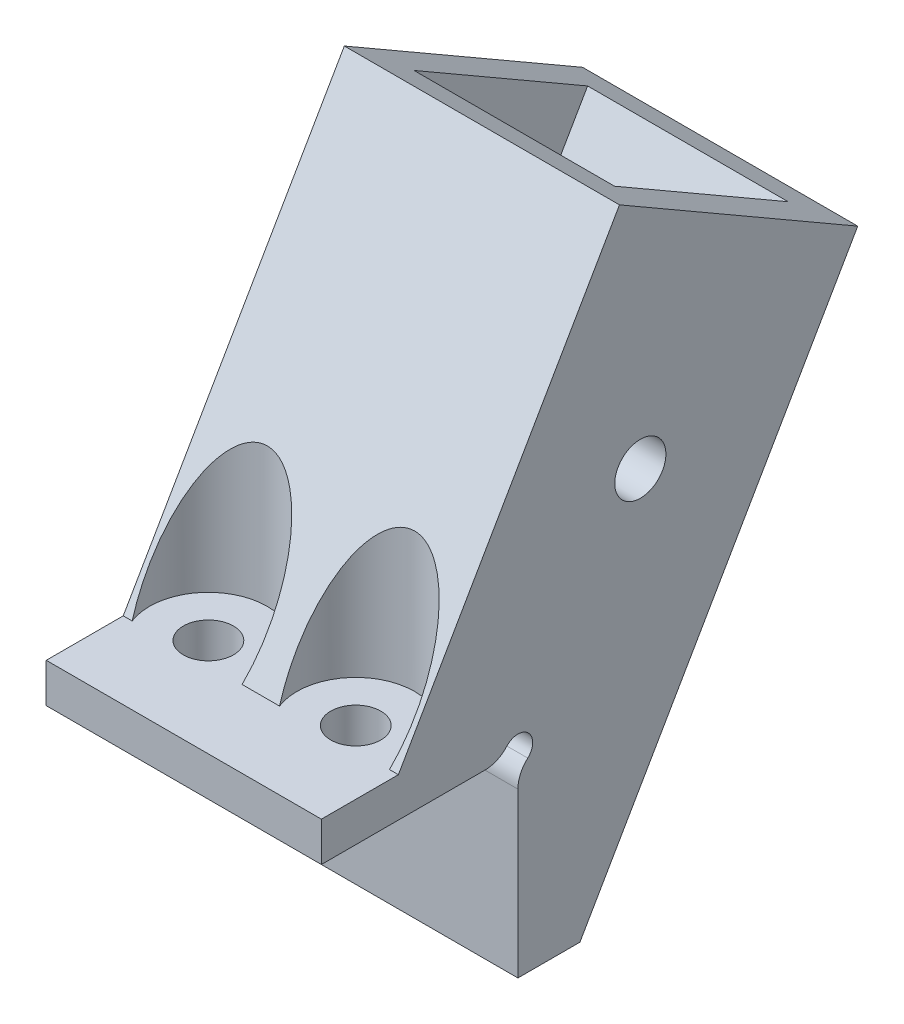
ISO-10303-21;
HEADER;
FILE_DESCRIPTION(('STEP AP214'),'2;1');
FILE_NAME('part.step','',(''),(''),'','','');
FILE_SCHEMA(('AUTOMOTIVE_DESIGN { 1 0 10303 214 1 1 1 1 }'));
ENDSEC;
DATA;
#1=APPLICATION_CONTEXT('core data for automotive mechanical design processes');
#2=APPLICATION_PROTOCOL_DEFINITION('international standard','automotive_design',2000,#1);
#3=PRODUCT_CONTEXT('',#1,'mechanical');
#4=PRODUCT('Part','Part','',(#3));
#5=PRODUCT_RELATED_PRODUCT_CATEGORY('part','',(#4));
#6=PRODUCT_DEFINITION_FORMATION('','',#4);
#7=PRODUCT_DEFINITION_CONTEXT('part definition',#1,'design');
#8=PRODUCT_DEFINITION('design','',#6,#7);
#9=PRODUCT_DEFINITION_SHAPE('','',#8);
#10=(LENGTH_UNIT() NAMED_UNIT(*) SI_UNIT(.MILLI.,.METRE.));
#11=(NAMED_UNIT(*) PLANE_ANGLE_UNIT() SI_UNIT($,.RADIAN.));
#12=(NAMED_UNIT(*) SI_UNIT($,.STERADIAN.) SOLID_ANGLE_UNIT());
#13=UNCERTAINTY_MEASURE_WITH_UNIT(LENGTH_MEASURE(1.E-05),#10,'distance_accuracy_value','');
#14=(GEOMETRIC_REPRESENTATION_CONTEXT(3) GLOBAL_UNCERTAINTY_ASSIGNED_CONTEXT((#13)) GLOBAL_UNIT_ASSIGNED_CONTEXT((#10,
#11,#12)) REPRESENTATION_CONTEXT('',''));
#15=CARTESIAN_POINT('',(0.,0.,0.));
#16=DIRECTION('',(0.,0.,1.));
#17=DIRECTION('',(1.,0.,0.));
#18=AXIS2_PLACEMENT_3D('',#15,#16,#17);
#19=CARTESIAN_POINT('',(0.,0.,16.1658075373095));
#20=DIRECTION('',(0.,0.499999999999998,0.86602540378444));
#21=DIRECTION('',(0.,-0.86602540378444,0.499999999999998));
#22=AXIS2_PLACEMENT_3D('',#19,#20,#21);
#23=PLANE('',#22);
#24=DIRECTION('',(1.,0.,0.));
#25=VECTOR('',#24,1.);
#26=CARTESIAN_POINT('',(0.,0.,16.1658075373095));
#27=LINE('',#26,#25);
#28=CARTESIAN_POINT('',(0.,0.,16.1658075373095));
#29=VERTEX_POINT('',#28);
#30=CARTESIAN_POINT('',(0.904530608489277,0.,16.1658075373095));
#31=VERTEX_POINT('',#30);
#32=EDGE_CURVE('E246',#29,#31,#27,.T.);
#33=ORIENTED_EDGE('',*,*,#32,.T.);
#34=CARTESIAN_POINT('',(6.5,3.7512886940357,14.));
#35=DIRECTION('',(0.,0.499999999999998,0.86602540378444));
#36=DIRECTION('',(0.,-0.86602540378444,0.499999999999998));
#37=AXIS2_PLACEMENT_3D('',#34,#35,#36);
#38=ELLIPSE('',#37,12.0000000000001,6.);
#39=CARTESIAN_POINT('',(12.0954693915107,0.,16.1658075373095));
#40=VERTEX_POINT('',#39);
#41=EDGE_CURVE('E290',#31,#40,#38,.F.);
#42=ORIENTED_EDGE('',*,*,#41,.T.);
#43=CARTESIAN_POINT('',(15.9045306084893,0.,16.1658075373095));
#44=VERTEX_POINT('',#43);
#45=EDGE_CURVE('E250',#40,#44,#27,.T.);
#46=ORIENTED_EDGE('',*,*,#45,.T.);
#47=CARTESIAN_POINT('',(21.5,3.7512886940357,14.));
#48=DIRECTION('',(0.,0.499999999999998,0.86602540378444));
#49=DIRECTION('',(0.,-0.86602540378444,0.499999999999998));
#50=AXIS2_PLACEMENT_3D('',#47,#48,#49);
#51=ELLIPSE('',#50,12.,6.);
#52=CARTESIAN_POINT('',(27.0954693915107,0.,16.1658075373095));
#53=VERTEX_POINT('',#52);
#54=EDGE_CURVE('E287',#44,#53,#51,.F.);
#55=ORIENTED_EDGE('',*,*,#54,.T.);
#56=CARTESIAN_POINT('',(28.,0.,16.1658075373095));
#57=VERTEX_POINT('',#56);
#58=EDGE_CURVE('E251',#53,#57,#27,.T.);
#59=ORIENTED_EDGE('',*,*,#58,.T.);
#60=DIRECTION('',(0.,-0.86602540378444,0.499999999999998));
#61=VECTOR('',#60,1.);
#62=CARTESIAN_POINT('',(28.,0.,16.1658075373095));
#63=LINE('',#62,#61);
#64=CARTESIAN_POINT('',(28.,38.9711431702998,-6.3341924626904));
#65=VERTEX_POINT('',#64);
#66=EDGE_CURVE('E232',#65,#57,#63,.T.);
#67=ORIENTED_EDGE('',*,*,#66,.F.);
#68=DIRECTION('',(1.,0.,0.));
#69=VECTOR('',#68,1.);
#70=CARTESIAN_POINT('',(0.,38.9711431702998,-6.3341924626904));
#71=LINE('',#70,#69);
#72=CARTESIAN_POINT('',(0.,38.9711431702998,-6.3341924626904));
#73=VERTEX_POINT('',#72);
#74=EDGE_CURVE('E252',#73,#65,#71,.T.);
#75=ORIENTED_EDGE('',*,*,#74,.F.);
#76=DIRECTION('',(0.,-0.86602540378444,0.499999999999998));
#77=VECTOR('',#76,1.);
#78=CARTESIAN_POINT('',(0.,0.,16.1658075373095));
#79=LINE('',#78,#77);
#80=EDGE_CURVE('E235',#73,#29,#79,.T.);
#81=ORIENTED_EDGE('',*,*,#80,.T.);
#82=EDGE_LOOP('',(#33,#42,#46,#55,#59,#67,#75,#81));
#83=FACE_BOUND('',#82,.T.);
#84=ADVANCED_FACE('F37',(#83),#23,.T.);
#85=CARTESIAN_POINT('',(21.5,38.9711431702998,14.));
#86=DIRECTION('',(0.,-1.,0.));
#87=DIRECTION('',(0.,0.,-1.));
#88=AXIS2_PLACEMENT_3D('',#85,#86,#87);
#89=CYLINDRICAL_SURFACE('',#88,2.55);
#90=CARTESIAN_POINT('',(21.5,-4.,14.));
#91=DIRECTION('',(0.,-1.,0.));
#92=DIRECTION('',(0.,0.,1.));
#93=AXIS2_PLACEMENT_3D('',#90,#91,#92);
#94=CIRCLE('',#93,2.55);
#95=CARTESIAN_POINT('',(21.5,-4.,16.55));
#96=VERTEX_POINT('',#95);
#97=EDGE_CURVE('E213',#96,#96,#94,.T.);
#98=ORIENTED_EDGE('',*,*,#97,.T.);
#99=EDGE_LOOP('',(#98));
#100=FACE_BOUND('',#99,.T.);
#101=CARTESIAN_POINT('',(21.5,0.,14.));
#102=DIRECTION('',(0.,-1.,0.));
#103=DIRECTION('',(0.,0.,-1.));
#104=AXIS2_PLACEMENT_3D('',#101,#102,#103);
#105=CIRCLE('',#104,2.55);
#106=CARTESIAN_POINT('',(21.5,0.,11.45));
#107=VERTEX_POINT('',#106);
#108=EDGE_CURVE('E219',#107,#107,#105,.T.);
#109=ORIENTED_EDGE('',*,*,#108,.F.);
#110=EDGE_LOOP('',(#109));
#111=FACE_BOUND('',#110,.T.);
#112=ADVANCED_FACE('F380',(#100,#111),#89,.F.);
#113=CARTESIAN_POINT('',(6.5,38.9711431702998,14.));
#114=DIRECTION('',(0.,-1.,0.));
#115=DIRECTION('',(0.,0.,-1.));
#116=AXIS2_PLACEMENT_3D('',#113,#114,#115);
#117=CYLINDRICAL_SURFACE('',#116,2.55);
#118=CARTESIAN_POINT('',(6.5,-4.,14.));
#119=DIRECTION('',(0.,-1.,0.));
#120=DIRECTION('',(0.,0.,-1.));
#121=AXIS2_PLACEMENT_3D('',#118,#119,#120);
#122=CIRCLE('',#121,2.55);
#123=CARTESIAN_POINT('',(6.5,-4.,11.45));
#124=VERTEX_POINT('',#123);
#125=EDGE_CURVE('E216',#124,#124,#122,.T.);
#126=ORIENTED_EDGE('',*,*,#125,.T.);
#127=EDGE_LOOP('',(#126));
#128=FACE_BOUND('',#127,.T.);
#129=CARTESIAN_POINT('',(6.5,0.,14.));
#130=DIRECTION('',(0.,-1.,0.));
#131=DIRECTION('',(0.,0.,-1.));
#132=AXIS2_PLACEMENT_3D('',#129,#130,#131);
#133=CIRCLE('',#132,2.55);
#134=CARTESIAN_POINT('',(6.5,0.,11.45));
#135=VERTEX_POINT('',#134);
#136=EDGE_CURVE('E224',#135,#135,#133,.T.);
#137=ORIENTED_EDGE('',*,*,#136,.F.);
#138=EDGE_LOOP('',(#137));
#139=FACE_BOUND('',#138,.T.);
#140=ADVANCED_FACE('F385',(#128,#139),#117,.F.);
#141=CARTESIAN_POINT('',(28.,0.,0.));
#142=DIRECTION('',(0.,-1.,0.));
#143=DIRECTION('',(0.,0.,-1.));
#144=AXIS2_PLACEMENT_3D('',#141,#142,#143);
#145=PLANE('',#144);
#146=ORIENTED_EDGE('',*,*,#45,.F.);
#147=CARTESIAN_POINT('',(6.5,0.,14.));
#148=DIRECTION('',(0.,1.,0.));
#149=DIRECTION('',(0.,0.,1.));
#150=AXIS2_PLACEMENT_3D('',#147,#148,#149);
#151=CIRCLE('',#150,6.);
#152=EDGE_CURVE('E210',#40,#31,#151,.T.);
#153=ORIENTED_EDGE('',*,*,#152,.T.);
#154=ORIENTED_EDGE('',*,*,#32,.F.);
#155=DIRECTION('',(0.,0.,1.));
#156=VECTOR('',#155,1.);
#157=CARTESIAN_POINT('',(0.,0.,0.));
#158=LINE('',#157,#156);
#159=CARTESIAN_POINT('',(0.,0.,24.));
#160=VERTEX_POINT('',#159);
#161=EDGE_CURVE('E249',#29,#160,#158,.T.);
#162=ORIENTED_EDGE('',*,*,#161,.T.);
#163=DIRECTION('',(-1.,0.,0.));
#164=VECTOR('',#163,1.);
#165=CARTESIAN_POINT('',(28.,0.,24.));
#166=LINE('',#165,#164);
#167=CARTESIAN_POINT('',(28.,0.,24.));
#168=VERTEX_POINT('',#167);
#169=EDGE_CURVE('E284',#168,#160,#166,.T.);
#170=ORIENTED_EDGE('',*,*,#169,.F.);
#171=DIRECTION('',(0.,0.,1.));
#172=VECTOR('',#171,1.);
#173=CARTESIAN_POINT('',(28.,0.,0.));
#174=LINE('',#173,#172);
#175=EDGE_CURVE('E258',#57,#168,#174,.T.);
#176=ORIENTED_EDGE('',*,*,#175,.F.);
#177=ORIENTED_EDGE('',*,*,#58,.F.);
#178=CARTESIAN_POINT('',(21.5,0.,14.));
#179=DIRECTION('',(0.,1.,0.));
#180=DIRECTION('',(0.,0.,1.));
#181=AXIS2_PLACEMENT_3D('',#178,#179,#180);
#182=CIRCLE('',#181,6.);
#183=EDGE_CURVE('E207',#53,#44,#182,.T.);
#184=ORIENTED_EDGE('',*,*,#183,.T.);
#185=EDGE_LOOP('',(#146,#153,#154,#162,#170,#176,#177,#184));
#186=FACE_BOUND('',#185,.T.);
#187=ORIENTED_EDGE('',*,*,#108,.T.);
#188=EDGE_LOOP('',(#187));
#189=FACE_BOUND('',#188,.T.);
#190=ORIENTED_EDGE('',*,*,#136,.T.);
#191=EDGE_LOOP('',(#190));
#192=FACE_BOUND('',#191,.T.);
#193=ADVANCED_FACE('F348',(#186,#189,#192),#145,.F.);
#194=CARTESIAN_POINT('',(28.,0.,24.));
#195=DIRECTION('',(0.,0.,-1.));
#196=DIRECTION('',(-1.,0.,0.));
#197=AXIS2_PLACEMENT_3D('',#194,#195,#196);
#198=PLANE('',#197);
#199=DIRECTION('',(0.,-1.,0.));
#200=VECTOR('',#199,1.);
#201=CARTESIAN_POINT('',(0.,0.,24.));
#202=LINE('',#201,#200);
#203=CARTESIAN_POINT('',(0.,-4.,24.));
#204=VERTEX_POINT('',#203);
#205=EDGE_CURVE('E271',#160,#204,#202,.T.);
#206=ORIENTED_EDGE('',*,*,#205,.T.);
#207=DIRECTION('',(-1.,0.,0.));
#208=VECTOR('',#207,1.);
#209=CARTESIAN_POINT('',(28.,-4.,24.));
#210=LINE('',#209,#208);
#211=CARTESIAN_POINT('',(28.,-4.,24.));
#212=VERTEX_POINT('',#211);
#213=EDGE_CURVE('E281',#212,#204,#210,.T.);
#214=ORIENTED_EDGE('',*,*,#213,.F.);
#215=DIRECTION('',(0.,-1.,0.));
#216=VECTOR('',#215,1.);
#217=CARTESIAN_POINT('',(28.,0.,24.));
#218=LINE('',#217,#216);
#219=EDGE_CURVE('E260',#168,#212,#218,.T.);
#220=ORIENTED_EDGE('',*,*,#219,.F.);
#221=ORIENTED_EDGE('',*,*,#169,.T.);
#222=EDGE_LOOP('',(#206,#214,#220,#221));
#223=FACE_BOUND('',#222,.T.);
#224=ADVANCED_FACE('F341',(#223),#198,.F.);
#225=CARTESIAN_POINT('',(28.,-4.,24.));
#226=DIRECTION('',(0.,1.,0.));
#227=DIRECTION('',(0.,0.,1.));
#228=AXIS2_PLACEMENT_3D('',#225,#226,#227);
#229=PLANE('',#228);
#230=ORIENTED_EDGE('',*,*,#125,.F.);
#231=EDGE_LOOP('',(#230));
#232=FACE_BOUND('',#231,.T.);
#233=ORIENTED_EDGE('',*,*,#97,.F.);
#234=EDGE_LOOP('',(#233));
#235=FACE_BOUND('',#234,.T.);
#236=DIRECTION('',(0.,0.,-1.));
#237=VECTOR('',#236,1.);
#238=CARTESIAN_POINT('',(0.,-4.,24.));
#239=LINE('',#238,#237);
#240=CARTESIAN_POINT('',(0.,-4.,7.35410196624969));
#241=VERTEX_POINT('',#240);
#242=EDGE_CURVE('E273',#204,#241,#239,.T.);
#243=ORIENTED_EDGE('',*,*,#242,.T.);
#244=DIRECTION('',(1.,0.,0.));
#245=VECTOR('',#244,1.);
#246=CARTESIAN_POINT('',(28.,-4.,7.35410196624969));
#247=LINE('',#246,#245);
#248=CARTESIAN_POINT('',(28.,-4.,7.35410196624969));
#249=VERTEX_POINT('',#248);
#250=EDGE_CURVE('E11',#241,#249,#247,.T.);
#251=ORIENTED_EDGE('',*,*,#250,.T.);
#252=DIRECTION('',(0.,0.,-1.));
#253=VECTOR('',#252,1.);
#254=CARTESIAN_POINT('',(28.,-4.,24.));
#255=LINE('',#254,#253);
#256=EDGE_CURVE('E263',#212,#249,#255,.T.);
#257=ORIENTED_EDGE('',*,*,#256,.F.);
#258=ORIENTED_EDGE('',*,*,#213,.T.);
#259=EDGE_LOOP('',(#243,#251,#257,#258));
#260=FACE_BOUND('',#259,.T.);
#261=ADVANCED_FACE('F336',(#232,#235,#260),#229,.F.);
#262=CARTESIAN_POINT('',(28.,-4.,4.));
#263=DIRECTION('',(0.,0.,-1.));
#264=DIRECTION('',(0.,1.,0.));
#265=AXIS2_PLACEMENT_3D('',#262,#263,#264);
#266=PLANE('',#265);
#267=DIRECTION('',(0.,-1.,0.));
#268=VECTOR('',#267,1.);
#269=CARTESIAN_POINT('',(28.,-4.,4.));
#270=LINE('',#269,#268);
#271=CARTESIAN_POINT('',(28.,-7.35410196624969,4.));
#272=VERTEX_POINT('',#271);
#273=CARTESIAN_POINT('',(28.,-24.,4.));
#274=VERTEX_POINT('',#273);
#275=EDGE_CURVE('E265',#272,#274,#270,.T.);
#276=ORIENTED_EDGE('',*,*,#275,.F.);
#277=DIRECTION('',(1.,0.,0.));
#278=VECTOR('',#277,1.);
#279=CARTESIAN_POINT('',(28.,-7.35410196624969,4.));
#280=LINE('',#279,#278);
#281=CARTESIAN_POINT('',(0.,-7.35410196624969,4.));
#282=VERTEX_POINT('',#281);
#283=EDGE_CURVE('E301',#272,#282,#280,.F.);
#284=ORIENTED_EDGE('',*,*,#283,.T.);
#285=DIRECTION('',(0.,-1.,0.));
#286=VECTOR('',#285,1.);
#287=CARTESIAN_POINT('',(0.,-4.,4.));
#288=LINE('',#287,#286);
#289=CARTESIAN_POINT('',(0.,-24.,4.));
#290=VERTEX_POINT('',#289);
#291=EDGE_CURVE('E276',#282,#290,#288,.T.);
#292=ORIENTED_EDGE('',*,*,#291,.T.);
#293=DIRECTION('',(-1.,0.,0.));
#294=VECTOR('',#293,1.);
#295=CARTESIAN_POINT('',(28.,-24.,4.));
#296=LINE('',#295,#294);
#297=EDGE_CURVE('E269',#274,#290,#296,.T.);
#298=ORIENTED_EDGE('',*,*,#297,.F.);
#299=EDGE_LOOP('',(#276,#284,#292,#298));
#300=FACE_BOUND('',#299,.T.);
#301=ADVANCED_FACE('F322',(#300),#266,.F.);
#302=CARTESIAN_POINT('',(28.,-24.,4.));
#303=DIRECTION('',(0.,1.,0.));
#304=DIRECTION('',(0.,0.,1.));
#305=AXIS2_PLACEMENT_3D('',#302,#303,#304);
#306=PLANE('',#305);
#307=DIRECTION('',(0.,0.,-1.));
#308=VECTOR('',#307,1.);
#309=CARTESIAN_POINT('',(0.,-24.,4.));
#310=LINE('',#309,#308);
#311=CARTESIAN_POINT('',(0.,-24.,-2.30940107675857));
#312=VERTEX_POINT('',#311);
#313=EDGE_CURVE('E261',#290,#312,#310,.T.);
#314=ORIENTED_EDGE('',*,*,#313,.T.);
#315=DIRECTION('',(1.,0.,0.));
#316=VECTOR('',#315,1.);
#317=CARTESIAN_POINT('',(0.,-24.,-2.30940107675857));
#318=LINE('',#317,#316);
#319=CARTESIAN_POINT('',(28.,-24.,-2.30940107675857));
#320=VERTEX_POINT('',#319);
#321=EDGE_CURVE('E238',#312,#320,#318,.T.);
#322=ORIENTED_EDGE('',*,*,#321,.T.);
#323=DIRECTION('',(0.,0.,-1.));
#324=VECTOR('',#323,1.);
#325=CARTESIAN_POINT('',(28.,-24.,4.));
#326=LINE('',#325,#324);
#327=EDGE_CURVE('E267',#274,#320,#326,.T.);
#328=ORIENTED_EDGE('',*,*,#327,.F.);
#329=ORIENTED_EDGE('',*,*,#297,.T.);
#330=EDGE_LOOP('',(#314,#322,#328,#329));
#331=FACE_BOUND('',#330,.T.);
#332=ADVANCED_FACE('F361',(#331),#306,.F.);
#333=CARTESIAN_POINT('',(28.,0.,0.));
#334=DIRECTION('',(1.,0.,0.));
#335=DIRECTION('',(0.,0.,-1.));
#336=AXIS2_PLACEMENT_3D('',#333,#334,#335);
#337=PLANE('',#336);
#338=CARTESIAN_POINT('',(28.,-4.,4.));
#339=DIRECTION('',(1.,0.,0.));
#340=DIRECTION('',(0.,0.,-1.));
#341=AXIS2_PLACEMENT_3D('',#338,#339,#340);
#342=CIRCLE('',#341,1.5);
#343=CARTESIAN_POINT('',(28.,-5.1180339887499,3.));
#344=VERTEX_POINT('',#343);
#345=CARTESIAN_POINT('',(28.,-3.,5.1180339887499));
#346=VERTEX_POINT('',#345);
#347=EDGE_CURVE('E317',#344,#346,#342,.T.);
#348=ORIENTED_EDGE('',*,*,#347,.F.);
#349=CARTESIAN_POINT('',(28.,-7.35410196624969,1.));
#350=DIRECTION('',(1.,0.,0.));
#351=DIRECTION('',(0.,0.,-1.));
#352=AXIS2_PLACEMENT_3D('',#349,#350,#351);
#353=CIRCLE('',#352,3.);
#354=EDGE_CURVE('E45',#344,#272,#353,.T.);
#355=ORIENTED_EDGE('',*,*,#354,.T.);
#356=ORIENTED_EDGE('',*,*,#275,.T.);
#357=ORIENTED_EDGE('',*,*,#327,.T.);
#358=DIRECTION('',(0.,0.86602540378444,-0.499999999999998));
#359=VECTOR('',#358,1.);
#360=CARTESIAN_POINT('',(28.,-24.,-2.30940107675857));
#361=LINE('',#360,#359);
#362=CARTESIAN_POINT('',(28.,24.9711431702999,-30.5829037686547));
#363=VERTEX_POINT('',#362);
#364=EDGE_CURVE('E227',#320,#363,#361,.T.);
#365=ORIENTED_EDGE('',*,*,#364,.T.);
#366=DIRECTION('',(0.,0.499999999999998,0.86602540378444));
#367=VECTOR('',#366,1.);
#368=CARTESIAN_POINT('',(28.,38.9711431702998,-6.3341924626904));
#369=LINE('',#368,#367);
#370=EDGE_CURVE('E241',#363,#65,#369,.T.);
#371=ORIENTED_EDGE('',*,*,#370,.T.);
#372=ORIENTED_EDGE('',*,*,#66,.T.);
#373=ORIENTED_EDGE('',*,*,#175,.T.);
#374=ORIENTED_EDGE('',*,*,#219,.T.);
#375=ORIENTED_EDGE('',*,*,#256,.T.);
#376=CARTESIAN_POINT('',(28.,-1.,7.35410196624969));
#377=DIRECTION('',(1.,0.,0.));
#378=DIRECTION('',(0.,0.,-1.));
#379=AXIS2_PLACEMENT_3D('',#376,#377,#378);
#380=CIRCLE('',#379,3.);
#381=EDGE_CURVE('E52',#249,#346,#380,.T.);
#382=ORIENTED_EDGE('',*,*,#381,.T.);
#383=EDGE_LOOP('',(#348,#355,#356,#357,#365,#371,#372,#373,#374,#375,#382));
#384=FACE_BOUND('',#383,.T.);
#385=CARTESIAN_POINT('',(28.,14.6506350946111,-8.45854811567263));
#386=DIRECTION('',(1.,0.,0.));
#387=DIRECTION('',(0.,0.,-1.));
#388=AXIS2_PLACEMENT_3D('',#385,#386,#387);
#389=CIRCLE('',#388,2.6);
#390=CARTESIAN_POINT('',(28.,14.6506350946111,-11.0585481156726));
#391=VERTEX_POINT('',#390);
#392=EDGE_CURVE('E452',#391,#391,#389,.T.);
#393=ORIENTED_EDGE('',*,*,#392,.F.);
#394=EDGE_LOOP('',(#393));
#395=FACE_BOUND('',#394,.T.);
#396=ADVANCED_FACE('F314',(#384,#395),#337,.T.);
#397=CARTESIAN_POINT('',(0.,0.,0.));
#398=DIRECTION('',(1.,0.,0.));
#399=DIRECTION('',(0.,0.,-1.));
#400=AXIS2_PLACEMENT_3D('',#397,#398,#399);
#401=PLANE('',#400);
#402=CARTESIAN_POINT('',(0.,14.6506350946111,-8.45854811567263));
#403=DIRECTION('',(1.,0.,0.));
#404=DIRECTION('',(0.,0.,-1.));
#405=AXIS2_PLACEMENT_3D('',#402,#403,#404);
#406=CIRCLE('',#405,2.6);
#407=CARTESIAN_POINT('',(0.,14.6506350946111,-11.0585481156726));
#408=VERTEX_POINT('',#407);
#409=EDGE_CURVE('E298',#408,#408,#406,.T.);
#410=ORIENTED_EDGE('',*,*,#409,.T.);
#411=EDGE_LOOP('',(#410));
#412=FACE_BOUND('',#411,.T.);
#413=ORIENTED_EDGE('',*,*,#291,.F.);
#414=CARTESIAN_POINT('',(0.,-7.35410196624969,1.));
#415=DIRECTION('',(1.,0.,0.));
#416=DIRECTION('',(0.,0.,-1.));
#417=AXIS2_PLACEMENT_3D('',#414,#415,#416);
#418=CIRCLE('',#417,3.);
#419=CARTESIAN_POINT('',(0.,-5.1180339887499,3.));
#420=VERTEX_POINT('',#419);
#421=EDGE_CURVE('E306',#282,#420,#418,.F.);
#422=ORIENTED_EDGE('',*,*,#421,.T.);
#423=CARTESIAN_POINT('',(0.,-4.,4.));
#424=DIRECTION('',(1.,0.,0.));
#425=DIRECTION('',(0.,0.,-1.));
#426=AXIS2_PLACEMENT_3D('',#423,#424,#425);
#427=CIRCLE('',#426,1.5);
#428=CARTESIAN_POINT('',(0.,-3.,5.1180339887499));
#429=VERTEX_POINT('',#428);
#430=EDGE_CURVE('E293',#420,#429,#427,.T.);
#431=ORIENTED_EDGE('',*,*,#430,.T.);
#432=CARTESIAN_POINT('',(0.,-1.,7.35410196624969));
#433=DIRECTION('',(1.,0.,0.));
#434=DIRECTION('',(0.,0.,-1.));
#435=AXIS2_PLACEMENT_3D('',#432,#433,#434);
#436=CIRCLE('',#435,3.);
#437=EDGE_CURVE('E304',#429,#241,#436,.F.);
#438=ORIENTED_EDGE('',*,*,#437,.T.);
#439=ORIENTED_EDGE('',*,*,#242,.F.);
#440=ORIENTED_EDGE('',*,*,#205,.F.);
#441=ORIENTED_EDGE('',*,*,#161,.F.);
#442=ORIENTED_EDGE('',*,*,#80,.F.);
#443=DIRECTION('',(0.,0.499999999999998,0.86602540378444));
#444=VECTOR('',#443,1.);
#445=CARTESIAN_POINT('',(0.,38.9711431702998,-6.3341924626904));
#446=LINE('',#445,#444);
#447=CARTESIAN_POINT('',(0.,24.9711431702999,-30.5829037686547));
#448=VERTEX_POINT('',#447);
#449=EDGE_CURVE('E231',#448,#73,#446,.T.);
#450=ORIENTED_EDGE('',*,*,#449,.F.);
#451=DIRECTION('',(0.,0.86602540378444,-0.499999999999998));
#452=VECTOR('',#451,1.);
#453=CARTESIAN_POINT('',(0.,-24.,-2.30940107675857));
#454=LINE('',#453,#452);
#455=EDGE_CURVE('E228',#312,#448,#454,.T.);
#456=ORIENTED_EDGE('',*,*,#455,.F.);
#457=ORIENTED_EDGE('',*,*,#313,.F.);
#458=EDGE_LOOP('',(#413,#422,#431,#438,#439,#440,#441,#442,#450,#456,#457));
#459=FACE_BOUND('',#458,.T.);
#460=ADVANCED_FACE('F328',(#412,#459),#401,.F.);
#461=CARTESIAN_POINT('',(0.,38.9711431702998,-6.3341924626904));
#462=DIRECTION('',(0.,0.86602540378444,-0.499999999999998));
#463=DIRECTION('',(0.,0.499999999999998,0.86602540378444));
#464=AXIS2_PLACEMENT_3D('',#461,#462,#463);
#465=PLANE('',#464);
#466=DIRECTION('',(0.,0.499999999999997,0.86602540378444));
#467=VECTOR('',#466,1.);
#468=CARTESIAN_POINT('',(3.8,26.8711431702999,-27.2920072342739));
#469=LINE('',#468,#467);
#470=CARTESIAN_POINT('',(3.8,26.8711431702999,-27.2920072342739));
#471=VERTEX_POINT('',#470);
#472=CARTESIAN_POINT('',(3.8,37.0711431702998,-9.62508899707126));
#473=VERTEX_POINT('',#472);
#474=EDGE_CURVE('E173',#471,#473,#469,.T.);
#475=ORIENTED_EDGE('',*,*,#474,.F.);
#476=DIRECTION('',(-1.,0.,0.));
#477=VECTOR('',#476,1.);
#478=CARTESIAN_POINT('',(3.8,26.8711431702999,-27.2920072342739));
#479=LINE('',#478,#477);
#480=CARTESIAN_POINT('',(24.2,26.8711431702999,-27.2920072342739));
#481=VERTEX_POINT('',#480);
#482=EDGE_CURVE('E202',#481,#471,#479,.T.);
#483=ORIENTED_EDGE('',*,*,#482,.F.);
#484=DIRECTION('',(0.,-0.499999999999997,-0.86602540378444));
#485=VECTOR('',#484,1.);
#486=CARTESIAN_POINT('',(24.2,26.8711431702999,-27.2920072342739));
#487=LINE('',#486,#485);
#488=CARTESIAN_POINT('',(24.2,37.0711431702998,-9.62508899707127));
#489=VERTEX_POINT('',#488);
#490=EDGE_CURVE('E200',#489,#481,#487,.T.);
#491=ORIENTED_EDGE('',*,*,#490,.F.);
#492=DIRECTION('',(1.,0.,0.));
#493=VECTOR('',#492,1.);
#494=CARTESIAN_POINT('',(24.2,37.0711431702998,-9.62508899707127));
#495=LINE('',#494,#493);
#496=EDGE_CURVE('E197',#473,#489,#495,.T.);
#497=ORIENTED_EDGE('',*,*,#496,.F.);
#498=EDGE_LOOP('',(#475,#483,#491,#497));
#499=FACE_BOUND('',#498,.T.);
#500=ORIENTED_EDGE('',*,*,#370,.F.);
#501=DIRECTION('',(1.,0.,0.));
#502=VECTOR('',#501,1.);
#503=CARTESIAN_POINT('',(0.,24.9711431702999,-30.5829037686547));
#504=LINE('',#503,#502);
#505=EDGE_CURVE('E254',#448,#363,#504,.T.);
#506=ORIENTED_EDGE('',*,*,#505,.F.);
#507=ORIENTED_EDGE('',*,*,#449,.T.);
#508=ORIENTED_EDGE('',*,*,#74,.T.);
#509=EDGE_LOOP('',(#500,#506,#507,#508));
#510=FACE_BOUND('',#509,.T.);
#511=ADVANCED_FACE('F354',(#499,#510),#465,.T.);
#512=CARTESIAN_POINT('',(0.,-24.,-2.30940107675857));
#513=DIRECTION('',(0.,-0.499999999999998,-0.86602540378444));
#514=DIRECTION('',(0.,0.86602540378444,-0.499999999999998));
#515=AXIS2_PLACEMENT_3D('',#512,#513,#514);
#516=PLANE('',#515);
#517=ORIENTED_EDGE('',*,*,#364,.F.);
#518=ORIENTED_EDGE('',*,*,#321,.F.);
#519=ORIENTED_EDGE('',*,*,#455,.T.);
#520=ORIENTED_EDGE('',*,*,#505,.T.);
#521=EDGE_LOOP('',(#517,#518,#519,#520));
#522=FACE_BOUND('',#521,.T.);
#523=ADVANCED_FACE('F359',(#522),#516,.T.);
#524=CARTESIAN_POINT('',(6.5,28.,14.));
#525=DIRECTION('',(0.,-1.,0.));
#526=DIRECTION('',(0.,0.,-1.));
#527=AXIS2_PLACEMENT_3D('',#524,#525,#526);
#528=CYLINDRICAL_SURFACE('',#527,6.);
#529=ORIENTED_EDGE('',*,*,#152,.F.);
#530=ORIENTED_EDGE('',*,*,#41,.F.);
#531=EDGE_LOOP('',(#529,#530));
#532=FACE_BOUND('',#531,.T.);
#533=ADVANCED_FACE('F366',(#532),#528,.F.);
#534=CARTESIAN_POINT('',(21.5,28.,14.));
#535=DIRECTION('',(0.,-1.,0.));
#536=DIRECTION('',(0.,0.,-1.));
#537=AXIS2_PLACEMENT_3D('',#534,#535,#536);
#538=CYLINDRICAL_SURFACE('',#537,6.);
#539=ORIENTED_EDGE('',*,*,#183,.F.);
#540=ORIENTED_EDGE('',*,*,#54,.F.);
#541=EDGE_LOOP('',(#539,#540));
#542=FACE_BOUND('',#541,.T.);
#543=ADVANCED_FACE('F368',(#542),#538,.F.);
#544=CARTESIAN_POINT('',(3.8,0.890381056766674,-12.2920072342739));
#545=DIRECTION('',(-1.,0.,0.));
#546=DIRECTION('',(0.,0.,1.));
#547=AXIS2_PLACEMENT_3D('',#544,#545,#546);
#548=PLANE('',#547);
#549=CARTESIAN_POINT('',(3.8,14.6506350946111,-8.45854811567263));
#550=DIRECTION('',(-1.,0.,0.));
#551=DIRECTION('',(0.,0.,1.));
#552=AXIS2_PLACEMENT_3D('',#549,#550,#551);
#553=CIRCLE('',#552,2.6);
#554=CARTESIAN_POINT('',(3.8,14.6506350946111,-5.85854811567262));
#555=VERTEX_POINT('',#554);
#556=EDGE_CURVE('E297',#555,#555,#553,.T.);
#557=ORIENTED_EDGE('',*,*,#556,.T.);
#558=EDGE_LOOP('',(#557));
#559=FACE_BOUND('',#558,.T.);
#560=ORIENTED_EDGE('',*,*,#474,.T.);
#561=DIRECTION('',(0.,0.86602540378444,-0.499999999999998));
#562=VECTOR('',#561,1.);
#563=CARTESIAN_POINT('',(3.8,11.0903810567666,5.37491100292867));
#564=LINE('',#563,#562);
#565=CARTESIAN_POINT('',(3.8,11.0903810567666,5.37491100292867));
#566=VERTEX_POINT('',#565);
#567=EDGE_CURVE('E187',#566,#473,#564,.T.);
#568=ORIENTED_EDGE('',*,*,#567,.F.);
#569=DIRECTION('',(0.,0.499999999999997,0.86602540378444));
#570=VECTOR('',#569,1.);
#571=CARTESIAN_POINT('',(3.8,0.890381056766674,-12.2920072342739));
#572=LINE('',#571,#570);
#573=CARTESIAN_POINT('',(3.8,5.99038105676665,-3.45854811567263));
#574=VERTEX_POINT('',#573);
#575=EDGE_CURVE('E192',#574,#566,#572,.T.);
#576=ORIENTED_EDGE('',*,*,#575,.F.);
#577=DIRECTION('',(0.,-1.,0.));
#578=VECTOR('',#577,1.);
#579=CARTESIAN_POINT('',(3.8,5.99038105676665,-3.45854811567263));
#580=LINE('',#579,#578);
#581=CARTESIAN_POINT('',(3.8,-14.4096189432335,-3.45854811567263));
#582=VERTEX_POINT('',#581);
#583=EDGE_CURVE('E169',#574,#582,#580,.T.);
#584=ORIENTED_EDGE('',*,*,#583,.T.);
#585=DIRECTION('',(0.,0.86602540378444,-0.499999999999998));
#586=VECTOR('',#585,1.);
#587=CARTESIAN_POINT('',(3.8,0.890381056766674,-12.2920072342739));
#588=LINE('',#587,#586);
#589=EDGE_CURVE('E205',#582,#471,#588,.T.);
#590=ORIENTED_EDGE('',*,*,#589,.T.);
#591=EDGE_LOOP('',(#560,#568,#576,#584,#590));
#592=FACE_BOUND('',#591,.T.);
#593=ADVANCED_FACE('F374',(#559,#592),#548,.F.);
#594=CARTESIAN_POINT('',(3.8,0.890381056766674,-12.2920072342739));
#595=DIRECTION('',(0.,-0.499999999999998,-0.86602540378444));
#596=DIRECTION('',(0.,0.86602540378444,-0.499999999999998));
#597=AXIS2_PLACEMENT_3D('',#594,#595,#596);
#598=PLANE('',#597);
#599=ORIENTED_EDGE('',*,*,#482,.T.);
#600=ORIENTED_EDGE('',*,*,#589,.F.);
#601=DIRECTION('',(-1.,0.,0.));
#602=VECTOR('',#601,1.);
#603=CARTESIAN_POINT('',(24.2,-14.4096189432335,-3.45854811567263));
#604=LINE('',#603,#602);
#605=CARTESIAN_POINT('',(24.2,-14.4096189432335,-3.45854811567263));
#606=VERTEX_POINT('',#605);
#607=EDGE_CURVE('E174',#606,#582,#604,.T.);
#608=ORIENTED_EDGE('',*,*,#607,.F.);
#609=DIRECTION('',(0.,0.86602540378444,-0.499999999999998));
#610=VECTOR('',#609,1.);
#611=CARTESIAN_POINT('',(24.2,0.890381056766674,-12.2920072342739));
#612=LINE('',#611,#610);
#613=EDGE_CURVE('E182',#606,#481,#612,.T.);
#614=ORIENTED_EDGE('',*,*,#613,.T.);
#615=EDGE_LOOP('',(#599,#600,#608,#614));
#616=FACE_BOUND('',#615,.T.);
#617=ADVANCED_FACE('F427',(#616),#598,.F.);
#618=CARTESIAN_POINT('',(24.2,0.890381056766674,-12.2920072342739));
#619=DIRECTION('',(1.,0.,0.));
#620=DIRECTION('',(0.,0.,-1.));
#621=AXIS2_PLACEMENT_3D('',#618,#619,#620);
#622=PLANE('',#621);
#623=CARTESIAN_POINT('',(24.2,14.6506350946111,-8.45854811567263));
#624=DIRECTION('',(1.,0.,0.));
#625=DIRECTION('',(0.,0.,-1.));
#626=AXIS2_PLACEMENT_3D('',#623,#624,#625);
#627=CIRCLE('',#626,2.6);
#628=CARTESIAN_POINT('',(24.2,14.6506350946111,-11.0585481156726));
#629=VERTEX_POINT('',#628);
#630=EDGE_CURVE('E294',#629,#629,#627,.T.);
#631=ORIENTED_EDGE('',*,*,#630,.T.);
#632=EDGE_LOOP('',(#631));
#633=FACE_BOUND('',#632,.T.);
#634=ORIENTED_EDGE('',*,*,#490,.T.);
#635=ORIENTED_EDGE('',*,*,#613,.F.);
#636=DIRECTION('',(0.,-1.,0.));
#637=VECTOR('',#636,1.);
#638=CARTESIAN_POINT('',(24.2,5.99038105676664,-3.45854811567263));
#639=LINE('',#638,#637);
#640=CARTESIAN_POINT('',(24.2,5.99038105676664,-3.45854811567263));
#641=VERTEX_POINT('',#640);
#642=EDGE_CURVE('E166',#641,#606,#639,.T.);
#643=ORIENTED_EDGE('',*,*,#642,.F.);
#644=DIRECTION('',(0.,-0.499999999999997,-0.86602540378444));
#645=VECTOR('',#644,1.);
#646=CARTESIAN_POINT('',(24.2,0.890381056766674,-12.2920072342739));
#647=LINE('',#646,#645);
#648=CARTESIAN_POINT('',(24.2,11.0903810567666,5.37491100292866));
#649=VERTEX_POINT('',#648);
#650=EDGE_CURVE('E180',#649,#641,#647,.T.);
#651=ORIENTED_EDGE('',*,*,#650,.F.);
#652=DIRECTION('',(0.,0.86602540378444,-0.499999999999998));
#653=VECTOR('',#652,1.);
#654=CARTESIAN_POINT('',(24.2,11.0903810567666,5.37491100292866));
#655=LINE('',#654,#653);
#656=EDGE_CURVE('E190',#649,#489,#655,.T.);
#657=ORIENTED_EDGE('',*,*,#656,.T.);
#658=EDGE_LOOP('',(#634,#635,#643,#651,#657));
#659=FACE_BOUND('',#658,.T.);
#660=ADVANCED_FACE('F179',(#633,#659),#622,.F.);
#661=CARTESIAN_POINT('',(24.2,11.0903810567666,5.37491100292866));
#662=DIRECTION('',(0.,0.499999999999998,0.86602540378444));
#663=DIRECTION('',(0.,-0.86602540378444,0.499999999999998));
#664=AXIS2_PLACEMENT_3D('',#661,#662,#663);
#665=PLANE('',#664);
#666=ORIENTED_EDGE('',*,*,#496,.T.);
#667=ORIENTED_EDGE('',*,*,#656,.F.);
#668=DIRECTION('',(1.,0.,0.));
#669=VECTOR('',#668,1.);
#670=CARTESIAN_POINT('',(24.2,11.0903810567666,5.37491100292866));
#671=LINE('',#670,#669);
#672=EDGE_CURVE('E186',#566,#649,#671,.T.);
#673=ORIENTED_EDGE('',*,*,#672,.F.);
#674=ORIENTED_EDGE('',*,*,#567,.T.);
#675=EDGE_LOOP('',(#666,#667,#673,#674));
#676=FACE_BOUND('',#675,.T.);
#677=ADVANCED_FACE('F426',(#676),#665,.F.);
#678=CARTESIAN_POINT('',(0.,5.99038105676666,-3.45854811567263));
#679=DIRECTION('',(0.,-0.86602540378444,0.499999999999997));
#680=DIRECTION('',(0.,-0.499999999999997,-0.86602540378444));
#681=AXIS2_PLACEMENT_3D('',#678,#679,#680);
#682=PLANE('',#681);
#683=ORIENTED_EDGE('',*,*,#650,.T.);
#684=DIRECTION('',(-1.,0.,0.));
#685=VECTOR('',#684,1.);
#686=CARTESIAN_POINT('',(24.2,5.99038105676664,-3.45854811567263));
#687=LINE('',#686,#685);
#688=EDGE_CURVE('E162',#641,#574,#687,.T.);
#689=ORIENTED_EDGE('',*,*,#688,.T.);
#690=ORIENTED_EDGE('',*,*,#575,.T.);
#691=ORIENTED_EDGE('',*,*,#672,.T.);
#692=EDGE_LOOP('',(#683,#689,#690,#691));
#693=FACE_BOUND('',#692,.T.);
#694=ADVANCED_FACE('F184',(#693),#682,.F.);
#695=CARTESIAN_POINT('',(24.2,5.99038105676664,-3.45854811567263));
#696=DIRECTION('',(0.,0.,-1.));
#697=DIRECTION('',(-1.,0.,0.));
#698=AXIS2_PLACEMENT_3D('',#695,#696,#697);
#699=PLANE('',#698);
#700=ORIENTED_EDGE('',*,*,#583,.F.);
#701=ORIENTED_EDGE('',*,*,#688,.F.);
#702=ORIENTED_EDGE('',*,*,#642,.T.);
#703=ORIENTED_EDGE('',*,*,#607,.T.);
#704=EDGE_LOOP('',(#700,#701,#702,#703));
#705=FACE_BOUND('',#704,.T.);
#706=ADVANCED_FACE('F164',(#705),#699,.T.);
#707=CARTESIAN_POINT('',(0.,14.6506350946111,-8.45854811567263));
#708=DIRECTION('',(1.,0.,0.));
#709=DIRECTION('',(0.,0.,-1.));
#710=AXIS2_PLACEMENT_3D('',#707,#708,#709);
#711=CYLINDRICAL_SURFACE('',#710,2.6);
#712=ORIENTED_EDGE('',*,*,#392,.T.);
#713=EDGE_LOOP('',(#712));
#714=FACE_BOUND('',#713,.T.);
#715=ORIENTED_EDGE('',*,*,#630,.F.);
#716=EDGE_LOOP('',(#715));
#717=FACE_BOUND('',#716,.T.);
#718=ADVANCED_FACE('F418',(#714,#717),#711,.F.);
#719=ORIENTED_EDGE('',*,*,#409,.F.);
#720=EDGE_LOOP('',(#719));
#721=FACE_BOUND('',#720,.T.);
#722=ORIENTED_EDGE('',*,*,#556,.F.);
#723=EDGE_LOOP('',(#722));
#724=FACE_BOUND('',#723,.T.);
#725=ADVANCED_FACE('F413',(#721,#724),#711,.F.);
#726=CARTESIAN_POINT('',(0.,-4.,4.));
#727=DIRECTION('',(1.,0.,0.));
#728=DIRECTION('',(0.,0.,-1.));
#729=AXIS2_PLACEMENT_3D('',#726,#727,#728);
#730=CYLINDRICAL_SURFACE('',#729,1.5);
#731=ORIENTED_EDGE('',*,*,#430,.F.);
#732=DIRECTION('',(1.,0.,0.));
#733=VECTOR('',#732,1.);
#734=CARTESIAN_POINT('',(0.,-5.1180339887499,3.));
#735=LINE('',#734,#733);
#736=EDGE_CURVE('E310',#420,#344,#735,.T.);
#737=ORIENTED_EDGE('',*,*,#736,.T.);
#738=ORIENTED_EDGE('',*,*,#347,.T.);
#739=DIRECTION('',(1.,0.,0.));
#740=VECTOR('',#739,1.);
#741=CARTESIAN_POINT('',(0.,-3.,5.1180339887499));
#742=LINE('',#741,#740);
#743=EDGE_CURVE('E308',#346,#429,#742,.F.);
#744=ORIENTED_EDGE('',*,*,#743,.T.);
#745=EDGE_LOOP('',(#731,#737,#738,#744));
#746=FACE_BOUND('',#745,.T.);
#747=ADVANCED_FACE('F332',(#746),#730,.F.);
#748=CARTESIAN_POINT('',(0.,-7.35410196624969,1.));
#749=DIRECTION('',(1.,0.,0.));
#750=DIRECTION('',(0.,0.,-1.));
#751=AXIS2_PLACEMENT_3D('',#748,#749,#750);
#752=CYLINDRICAL_SURFACE('',#751,3.);
#753=ORIENTED_EDGE('',*,*,#354,.F.);
#754=ORIENTED_EDGE('',*,*,#736,.F.);
#755=ORIENTED_EDGE('',*,*,#421,.F.);
#756=ORIENTED_EDGE('',*,*,#283,.F.);
#757=EDGE_LOOP('',(#753,#754,#755,#756));
#758=FACE_BOUND('',#757,.T.);
#759=ADVANCED_FACE('F325',(#758),#752,.T.);
#760=CARTESIAN_POINT('',(0.,-1.,7.35410196624969));
#761=DIRECTION('',(1.,0.,0.));
#762=DIRECTION('',(0.,0.,-1.));
#763=AXIS2_PLACEMENT_3D('',#760,#761,#762);
#764=CYLINDRICAL_SURFACE('',#763,3.);
#765=ORIENTED_EDGE('',*,*,#437,.F.);
#766=ORIENTED_EDGE('',*,*,#743,.F.);
#767=ORIENTED_EDGE('',*,*,#381,.F.);
#768=ORIENTED_EDGE('',*,*,#250,.F.);
#769=EDGE_LOOP('',(#765,#766,#767,#768));
#770=FACE_BOUND('',#769,.T.);
#771=ADVANCED_FACE('F39',(#770),#764,.T.);
#772=CLOSED_SHELL('',(#84,#112,#140,#193,#224,#261,#301,#332,#396,#460,#511,#523,#533,#543,#593,
#617,#660,#677,#694,#706,#718,#725,#747,#759,#771));
#773=MANIFOLD_SOLID_BREP('B2',#772);
#774=ADVANCED_BREP_SHAPE_REPRESENTATION('',(#18,#773),#14);
#775=SHAPE_DEFINITION_REPRESENTATION(#9,#774);
ENDSEC;
END-ISO-10303-21;
